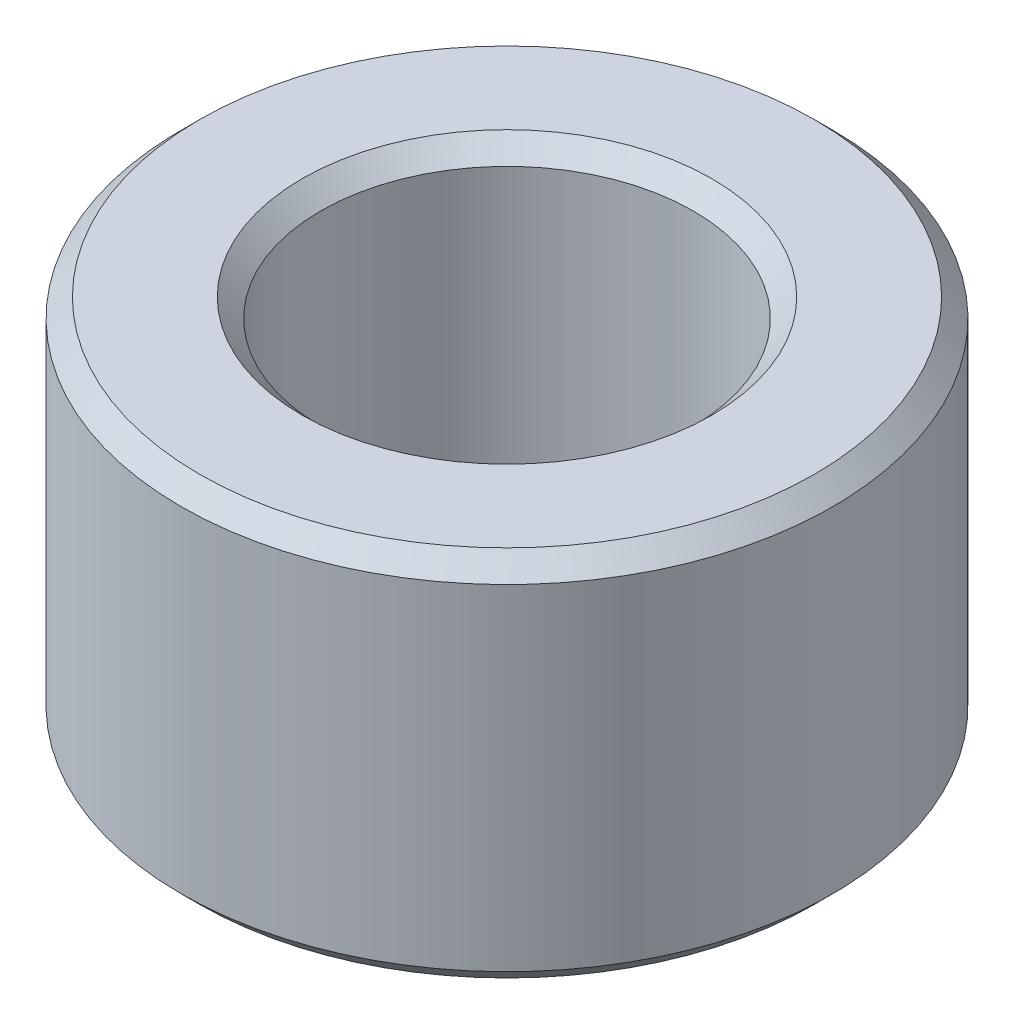
ISO-10303-21;
HEADER;
FILE_DESCRIPTION(('STEP AP214'),'2;1');
FILE_NAME('part.step','',(''),(''),'','','');
FILE_SCHEMA(('AUTOMOTIVE_DESIGN { 1 0 10303 214 1 1 1 1 }'));
ENDSEC;
DATA;
#1=APPLICATION_CONTEXT('core data for automotive mechanical design processes');
#2=APPLICATION_PROTOCOL_DEFINITION('international standard','automotive_design',2000,#1);
#3=PRODUCT_CONTEXT('',#1,'mechanical');
#4=PRODUCT('Part','Part','',(#3));
#5=PRODUCT_RELATED_PRODUCT_CATEGORY('part','',(#4));
#6=PRODUCT_DEFINITION_FORMATION('','',#4);
#7=PRODUCT_DEFINITION_CONTEXT('part definition',#1,'design');
#8=PRODUCT_DEFINITION('design','',#6,#7);
#9=PRODUCT_DEFINITION_SHAPE('','',#8);
#10=(LENGTH_UNIT() NAMED_UNIT(*) SI_UNIT(.MILLI.,.METRE.));
#11=(NAMED_UNIT(*) PLANE_ANGLE_UNIT() SI_UNIT($,.RADIAN.));
#12=(NAMED_UNIT(*) SI_UNIT($,.STERADIAN.) SOLID_ANGLE_UNIT());
#13=UNCERTAINTY_MEASURE_WITH_UNIT(LENGTH_MEASURE(1.E-05),#10,'distance_accuracy_value','');
#14=(GEOMETRIC_REPRESENTATION_CONTEXT(3) GLOBAL_UNCERTAINTY_ASSIGNED_CONTEXT((#13)) GLOBAL_UNIT_ASSIGNED_CONTEXT((#10,
#11,#12)) REPRESENTATION_CONTEXT('',''));
#15=CARTESIAN_POINT('',(0.,0.,0.));
#16=DIRECTION('',(0.,0.,1.));
#17=DIRECTION('',(1.,0.,0.));
#18=AXIS2_PLACEMENT_3D('',#15,#16,#17);
#19=CARTESIAN_POINT('',(0.,4.,0.));
#20=DIRECTION('',(0.,1.,0.));
#21=DIRECTION('',(0.,0.,1.));
#22=AXIS2_PLACEMENT_3D('',#19,#20,#21);
#23=PLANE('',#22);
#24=CARTESIAN_POINT('',(0.,4.,0.));
#25=DIRECTION('',(0.,1.,0.));
#26=DIRECTION('',(0.,0.,1.));
#27=AXIS2_PLACEMENT_3D('',#24,#25,#26);
#28=CIRCLE('',#27,2.2);
#29=CARTESIAN_POINT('',(0.,4.,2.2));
#30=VERTEX_POINT('',#29);
#31=EDGE_CURVE('E10',#30,#30,#28,.F.);
#32=ORIENTED_EDGE('',*,*,#31,.T.);
#33=EDGE_LOOP('',(#32));
#34=FACE_BOUND('',#33,.T.);
#35=CARTESIAN_POINT('',(0.,4.,0.));
#36=DIRECTION('',(0.,1.,0.));
#37=DIRECTION('',(0.,0.,1.));
#38=AXIS2_PLACEMENT_3D('',#35,#36,#37);
#39=CIRCLE('',#38,3.3);
#40=CARTESIAN_POINT('',(0.,4.,3.3));
#41=VERTEX_POINT('',#40);
#42=EDGE_CURVE('E51',#41,#41,#39,.T.);
#43=ORIENTED_EDGE('',*,*,#42,.T.);
#44=EDGE_LOOP('',(#43));
#45=FACE_BOUND('',#44,.T.);
#46=ADVANCED_FACE('F42',(#34,#45),#23,.T.);
#47=CARTESIAN_POINT('',(0.,0.,0.));
#48=DIRECTION('',(0.,1.,0.));
#49=DIRECTION('',(0.,0.,1.));
#50=AXIS2_PLACEMENT_3D('',#47,#48,#49);
#51=PLANE('',#50);
#52=CARTESIAN_POINT('',(0.,0.,0.));
#53=DIRECTION('',(0.,1.,0.));
#54=DIRECTION('',(0.,0.,1.));
#55=AXIS2_PLACEMENT_3D('',#52,#53,#54);
#56=CIRCLE('',#55,2.2);
#57=CARTESIAN_POINT('',(0.,0.,-2.2));
#58=VERTEX_POINT('',#57);
#59=EDGE_CURVE('E75',#58,#58,#56,.T.);
#60=ORIENTED_EDGE('',*,*,#59,.T.);
#61=EDGE_LOOP('',(#60));
#62=FACE_BOUND('',#61,.T.);
#63=CARTESIAN_POINT('',(0.,0.,0.));
#64=DIRECTION('',(0.,1.,0.));
#65=DIRECTION('',(0.,0.,1.));
#66=AXIS2_PLACEMENT_3D('',#63,#64,#65);
#67=CIRCLE('',#66,3.3);
#68=CARTESIAN_POINT('',(0.,0.,3.3));
#69=VERTEX_POINT('',#68);
#70=EDGE_CURVE('E79',#69,#69,#67,.F.);
#71=ORIENTED_EDGE('',*,*,#70,.T.);
#72=EDGE_LOOP('',(#71));
#73=FACE_BOUND('',#72,.T.);
#74=ADVANCED_FACE('F84',(#62,#73),#51,.F.);
#75=CARTESIAN_POINT('',(0.,4.,0.));
#76=DIRECTION('',(0.,-1.,0.));
#77=DIRECTION('',(0.,0.,-1.));
#78=AXIS2_PLACEMENT_3D('',#75,#76,#77);
#79=CYLINDRICAL_SURFACE('',#78,3.5);
#80=CARTESIAN_POINT('',(0.,0.2,0.));
#81=DIRECTION('',(0.,1.,0.));
#82=DIRECTION('',(0.,0.,1.));
#83=AXIS2_PLACEMENT_3D('',#80,#81,#82);
#84=CIRCLE('',#83,3.5);
#85=CARTESIAN_POINT('',(0.,0.2,3.5));
#86=VERTEX_POINT('',#85);
#87=EDGE_CURVE('E56',#86,#86,#84,.T.);
#88=ORIENTED_EDGE('',*,*,#87,.T.);
#89=EDGE_LOOP('',(#88));
#90=FACE_BOUND('',#89,.T.);
#91=CARTESIAN_POINT('',(0.,3.8,0.));
#92=DIRECTION('',(0.,1.,0.));
#93=DIRECTION('',(0.,0.,1.));
#94=AXIS2_PLACEMENT_3D('',#91,#92,#93);
#95=CIRCLE('',#94,3.5);
#96=CARTESIAN_POINT('',(0.,3.8,3.5));
#97=VERTEX_POINT('',#96);
#98=EDGE_CURVE('E61',#97,#97,#95,.F.);
#99=ORIENTED_EDGE('',*,*,#98,.T.);
#100=EDGE_LOOP('',(#99));
#101=FACE_BOUND('',#100,.T.);
#102=ADVANCED_FACE('F94',(#90,#101),#79,.T.);
#103=CARTESIAN_POINT('',(0.,4.,0.));
#104=DIRECTION('',(0.,-1.,0.));
#105=DIRECTION('',(0.,0.,-1.));
#106=AXIS2_PLACEMENT_3D('',#103,#104,#105);
#107=CYLINDRICAL_SURFACE('',#106,2.);
#108=CARTESIAN_POINT('',(0.,0.2,0.));
#109=DIRECTION('',(0.,1.,0.));
#110=DIRECTION('',(0.,0.,1.));
#111=AXIS2_PLACEMENT_3D('',#108,#109,#110);
#112=CIRCLE('',#111,2.);
#113=CARTESIAN_POINT('',(0.,0.2,-2.));
#114=VERTEX_POINT('',#113);
#115=EDGE_CURVE('E67',#114,#114,#112,.F.);
#116=ORIENTED_EDGE('',*,*,#115,.T.);
#117=EDGE_LOOP('',(#116));
#118=FACE_BOUND('',#117,.T.);
#119=CARTESIAN_POINT('',(0.,3.8,0.));
#120=DIRECTION('',(0.,1.,0.));
#121=DIRECTION('',(0.,0.,1.));
#122=AXIS2_PLACEMENT_3D('',#119,#120,#121);
#123=CIRCLE('',#122,2.);
#124=CARTESIAN_POINT('',(0.,3.8,2.));
#125=VERTEX_POINT('',#124);
#126=EDGE_CURVE('E71',#125,#125,#123,.T.);
#127=ORIENTED_EDGE('',*,*,#126,.T.);
#128=EDGE_LOOP('',(#127));
#129=FACE_BOUND('',#128,.T.);
#130=ADVANCED_FACE('F97',(#118,#129),#107,.F.);
#131=CARTESIAN_POINT('',(0.,0.,0.));
#132=DIRECTION('',(0.,-1.,0.));
#133=DIRECTION('',(0.,0.,-1.));
#134=AXIS2_PLACEMENT_3D('',#131,#132,#133);
#135=CONICAL_SURFACE('',#134,2.2,0.785398163397444);
#136=CARTESIAN_POINT('',(0.,0.2,-2.));
#137=CARTESIAN_POINT('',(0.,0.197916666666666,-2.00208333333333));
#138=CARTESIAN_POINT('',(0.,0.195833333333333,-2.00416666666667));
#139=CARTESIAN_POINT('',(0.,0.191666666666666,-2.00833333333333));
#140=CARTESIAN_POINT('',(0.,0.189583333333333,-2.01041666666667));
#141=CARTESIAN_POINT('',(0.,0.185416666666666,-2.01458333333333));
#142=CARTESIAN_POINT('',(0.,0.183333333333333,-2.01666666666667));
#143=CARTESIAN_POINT('',(0.,0.179166666666666,-2.02083333333333));
#144=CARTESIAN_POINT('',(0.,0.177083333333333,-2.02291666666667));
#145=CARTESIAN_POINT('',(0.,0.172916666666666,-2.02708333333333));
#146=CARTESIAN_POINT('',(0.,0.170833333333333,-2.02916666666667));
#147=CARTESIAN_POINT('',(0.,0.166666666666666,-2.03333333333333));
#148=CARTESIAN_POINT('',(0.,0.164583333333333,-2.03541666666667));
#149=CARTESIAN_POINT('',(0.,0.160416666666666,-2.03958333333333));
#150=CARTESIAN_POINT('',(0.,0.158333333333333,-2.04166666666667));
#151=CARTESIAN_POINT('',(0.,0.154166666666666,-2.04583333333333));
#152=CARTESIAN_POINT('',(0.,0.152083333333333,-2.04791666666667));
#153=CARTESIAN_POINT('',(0.,0.147916666666666,-2.05208333333333));
#154=CARTESIAN_POINT('',(0.,0.145833333333333,-2.05416666666667));
#155=CARTESIAN_POINT('',(0.,0.141666666666666,-2.05833333333333));
#156=CARTESIAN_POINT('',(0.,0.139583333333333,-2.06041666666667));
#157=CARTESIAN_POINT('',(0.,0.135416666666666,-2.06458333333333));
#158=CARTESIAN_POINT('',(0.,0.133333333333333,-2.06666666666667));
#159=CARTESIAN_POINT('',(0.,0.129166666666666,-2.07083333333333));
#160=CARTESIAN_POINT('',(0.,0.127083333333333,-2.07291666666667));
#161=CARTESIAN_POINT('',(0.,0.122916666666666,-2.07708333333333));
#162=CARTESIAN_POINT('',(0.,0.120833333333333,-2.07916666666667));
#163=CARTESIAN_POINT('',(0.,0.116666666666666,-2.08333333333333));
#164=CARTESIAN_POINT('',(0.,0.114583333333333,-2.08541666666667));
#165=CARTESIAN_POINT('',(0.,0.110416666666666,-2.08958333333333));
#166=CARTESIAN_POINT('',(0.,0.108333333333333,-2.09166666666667));
#167=CARTESIAN_POINT('',(0.,0.104166666666667,-2.09583333333333));
#168=CARTESIAN_POINT('',(0.,0.102083333333333,-2.09791666666667));
#169=CARTESIAN_POINT('',(0.,0.0979166666666665,-2.10208333333333));
#170=CARTESIAN_POINT('',(0.,0.0958333333333331,-2.10416666666667));
#171=CARTESIAN_POINT('',(0.,0.0916666666666665,-2.10833333333333));
#172=CARTESIAN_POINT('',(0.,0.0895833333333332,-2.11041666666667));
#173=CARTESIAN_POINT('',(0.,0.0854166666666665,-2.11458333333333));
#174=CARTESIAN_POINT('',(0.,0.0833333333333331,-2.11666666666667));
#175=CARTESIAN_POINT('',(0.,0.0791666666666665,-2.12083333333333));
#176=CARTESIAN_POINT('',(0.,0.0770833333333332,-2.12291666666667));
#177=CARTESIAN_POINT('',(0.,0.0729166666666666,-2.12708333333333));
#178=CARTESIAN_POINT('',(0.,0.0708333333333332,-2.12916666666667));
#179=CARTESIAN_POINT('',(0.,0.0666666666666665,-2.13333333333333));
#180=CARTESIAN_POINT('',(0.,0.0645833333333332,-2.13541666666667));
#181=CARTESIAN_POINT('',(0.,0.0604166666666666,-2.13958333333333));
#182=CARTESIAN_POINT('',(0.,0.0583333333333332,-2.14166666666667));
#183=CARTESIAN_POINT('',(0.,0.0541666666666665,-2.14583333333333));
#184=CARTESIAN_POINT('',(0.,0.0520833333333333,-2.14791666666667));
#185=CARTESIAN_POINT('',(0.,0.0479166666666666,-2.15208333333333));
#186=CARTESIAN_POINT('',(0.,0.0458333333333333,-2.15416666666667));
#187=CARTESIAN_POINT('',(0.,0.0416666666666666,-2.15833333333333));
#188=CARTESIAN_POINT('',(0.,0.0395833333333332,-2.16041666666667));
#189=CARTESIAN_POINT('',(0.,0.0354166666666666,-2.16458333333333));
#190=CARTESIAN_POINT('',(0.,0.0333333333333333,-2.16666666666666));
#191=CARTESIAN_POINT('',(0.,0.0291666666666666,-2.17083333333333));
#192=CARTESIAN_POINT('',(0.,0.0270833333333332,-2.17291666666666));
#193=CARTESIAN_POINT('',(0.,0.0229166666666666,-2.17708333333333));
#194=CARTESIAN_POINT('',(0.,0.0208333333333333,-2.17916666666666));
#195=CARTESIAN_POINT('',(0.,0.0166666666666667,-2.18333333333333));
#196=CARTESIAN_POINT('',(0.,0.0145833333333333,-2.18541666666667));
#197=CARTESIAN_POINT('',(0.,0.0104166666666666,-2.18958333333333));
#198=CARTESIAN_POINT('',(0.,0.00833333333333331,-2.19166666666666));
#199=CARTESIAN_POINT('',(0.,0.00416666666666674,-2.19583333333333));
#200=CARTESIAN_POINT('',(0.,0.00208333333333345,-2.19791666666666));
#201=CARTESIAN_POINT('',(0.,0.,-2.2));
#202=B_SPLINE_CURVE_WITH_KNOTS('',3,(#136,#137,#138,#139,#140,#141,#142,#143,#144,#145,#146,
#147,#148,#149,#150,#151,#152,#153,#154,#155,#156,#157,#158,#159,#160,#161,#162,#163,#164,#165,
#166,#167,#168,#169,#170,#171,#172,#173,#174,#175,#176,#177,#178,#179,#180,#181,#182,#183,#184,
#185,#186,#187,#188,#189,#190,#191,#192,#193,#194,#195,#196,#197,#198,#199,#200,#201),
.UNSPECIFIED.,.F.,.F.,(4,2,2,2,2,2,2,2,2,2,2,2,2,2,2,2,2,2,2,2,2,2,2,2,2,2,2,2,2,2,2,2,4),(0.,
0.00883883476483196,0.0176776695296636,0.0265165042944953,0.0353553390593272,0.0441941738241589,
0.0530330085889908,0.0618718433538225,0.0707106781186545,0.0795495128834861,0.0883883476483178,
0.0972271824131497,0.106066017177981,0.114904851942813,0.123743686707645,0.132582521472477,
0.141421356237309,0.15026019100214,0.159099025766972,0.167937860531804,0.176776695296636,
0.185615530061468,0.1944543648263,0.203293199591131,0.212132034355963,0.220970869120795,
0.229809703885626,0.238648538650458,0.24748737341529,0.256326208180122,0.265165042944954,
0.274003877709786,0.282842712474617),.UNSPECIFIED.);
#203=EDGE_CURVE('BSEAM90',#114,#58,#202,.T.);
#204=ORIENTED_EDGE('',*,*,#115,.F.);
#205=ORIENTED_EDGE('',*,*,#59,.F.);
#206=ORIENTED_EDGE('',*,*,#203,.T.);
#207=ORIENTED_EDGE('',*,*,#203,.F.);
#208=EDGE_LOOP('',(#204,#206,#205,#207));
#209=FACE_BOUND('',#208,.T.);
#210=ADVANCED_FACE('F90',(#209),#135,.F.);
#211=CARTESIAN_POINT('',(0.,0.2,0.));
#212=DIRECTION('',(0.,1.,0.));
#213=DIRECTION('',(0.,0.,1.));
#214=AXIS2_PLACEMENT_3D('',#211,#212,#213);
#215=CONICAL_SURFACE('',#214,3.5,0.785398163397448);
#216=ORIENTED_EDGE('',*,*,#70,.F.);
#217=EDGE_LOOP('',(#216));
#218=FACE_BOUND('',#217,.T.);
#219=ORIENTED_EDGE('',*,*,#87,.F.);
#220=EDGE_LOOP('',(#219));
#221=FACE_BOUND('',#220,.T.);
#222=ADVANCED_FACE('F86',(#218,#221),#215,.T.);
#223=CARTESIAN_POINT('',(0.,3.8,0.));
#224=DIRECTION('',(0.,1.,0.));
#225=DIRECTION('',(0.,0.,1.));
#226=AXIS2_PLACEMENT_3D('',#223,#224,#225);
#227=CONICAL_SURFACE('',#226,2.,0.785398163397451);
#228=ORIENTED_EDGE('',*,*,#31,.F.);
#229=EDGE_LOOP('',(#228));
#230=FACE_BOUND('',#229,.T.);
#231=ORIENTED_EDGE('',*,*,#126,.F.);
#232=EDGE_LOOP('',(#231));
#233=FACE_BOUND('',#232,.T.);
#234=ADVANCED_FACE('F89',(#230,#233),#227,.F.);
#235=CARTESIAN_POINT('',(0.,4.,0.));
#236=DIRECTION('',(0.,-1.,0.));
#237=DIRECTION('',(0.,0.,-1.));
#238=AXIS2_PLACEMENT_3D('',#235,#236,#237);
#239=CONICAL_SURFACE('',#238,3.3,0.785398163397447);
#240=ORIENTED_EDGE('',*,*,#98,.F.);
#241=EDGE_LOOP('',(#240));
#242=FACE_BOUND('',#241,.T.);
#243=ORIENTED_EDGE('',*,*,#42,.F.);
#244=EDGE_LOOP('',(#243));
#245=FACE_BOUND('',#244,.T.);
#246=ADVANCED_FACE('F45',(#242,#245),#239,.T.);
#247=CLOSED_SHELL('',(#46,#74,#102,#130,#210,#222,#234,#246));
#248=MANIFOLD_SOLID_BREP('B2',#247);
#249=ADVANCED_BREP_SHAPE_REPRESENTATION('',(#18,#248),#14);
#250=SHAPE_DEFINITION_REPRESENTATION(#9,#249);
ENDSEC;
END-ISO-10303-21;
